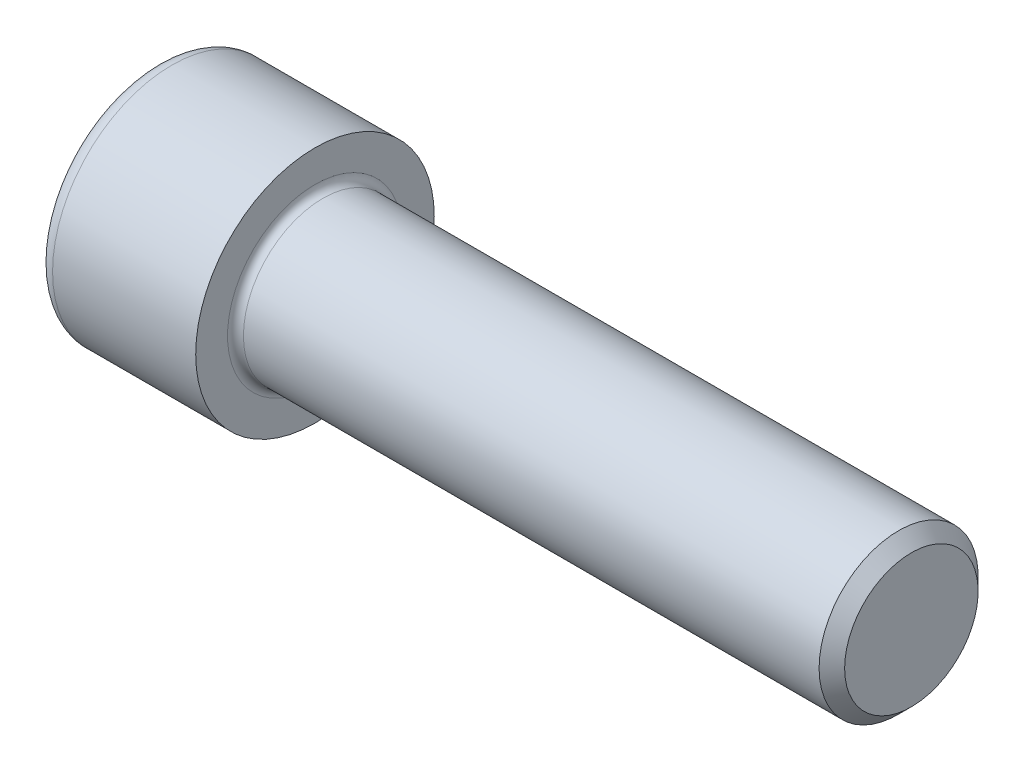
ISO-10303-21;
HEADER;
FILE_DESCRIPTION(('STEP AP214'),'2;1');
FILE_NAME('part.step','',(''),(''),'','','');
FILE_SCHEMA(('AUTOMOTIVE_DESIGN { 1 0 10303 214 1 1 1 1 }'));
ENDSEC;
DATA;
#1=APPLICATION_CONTEXT('core data for automotive mechanical design processes');
#2=APPLICATION_PROTOCOL_DEFINITION('international standard','automotive_design',2000,#1);
#3=PRODUCT_CONTEXT('',#1,'mechanical');
#4=PRODUCT('Part','Part','',(#3));
#5=PRODUCT_RELATED_PRODUCT_CATEGORY('part','',(#4));
#6=PRODUCT_DEFINITION_FORMATION('','',#4);
#7=PRODUCT_DEFINITION_CONTEXT('part definition',#1,'design');
#8=PRODUCT_DEFINITION('design','',#6,#7);
#9=PRODUCT_DEFINITION_SHAPE('','',#8);
#10=(LENGTH_UNIT() NAMED_UNIT(*) SI_UNIT(.MILLI.,.METRE.));
#11=(NAMED_UNIT(*) PLANE_ANGLE_UNIT() SI_UNIT($,.RADIAN.));
#12=(NAMED_UNIT(*) SI_UNIT($,.STERADIAN.) SOLID_ANGLE_UNIT());
#13=UNCERTAINTY_MEASURE_WITH_UNIT(LENGTH_MEASURE(1.E-05),#10,'distance_accuracy_value','');
#14=(GEOMETRIC_REPRESENTATION_CONTEXT(3) GLOBAL_UNCERTAINTY_ASSIGNED_CONTEXT((#13)) GLOBAL_UNIT_ASSIGNED_CONTEXT((#10,
#11,#12)) REPRESENTATION_CONTEXT('',''));
#15=CARTESIAN_POINT('',(0.,0.,0.));
#16=DIRECTION('',(0.,0.,1.));
#17=DIRECTION('',(1.,0.,0.));
#18=AXIS2_PLACEMENT_3D('',#15,#16,#17);
#19=CARTESIAN_POINT('',(0.,0.,0.));
#20=DIRECTION('',(-1.,0.,0.));
#21=DIRECTION('',(0.,0.,1.));
#22=AXIS2_PLACEMENT_3D('',#19,#20,#21);
#23=PLANE('',#22);
#24=DIRECTION('',(0.,-0.499999999999999,0.866025403784439));
#25=VECTOR('',#24,1.);
#26=CARTESIAN_POINT('',(0.,5.78793644862599,0.));
#27=LINE('',#26,#25);
#28=CARTESIAN_POINT('',(0.,5.78793644862599,0.));
#29=VERTEX_POINT('',#28);
#30=CARTESIAN_POINT('',(0.,2.893968224313,5.01249999999999));
#31=VERTEX_POINT('',#30);
#32=EDGE_CURVE('E259',#29,#31,#27,.T.);
#33=ORIENTED_EDGE('',*,*,#32,.T.);
#34=DIRECTION('',(0.,1.,0.));
#35=VECTOR('',#34,1.);
#36=CARTESIAN_POINT('',(0.,-2.893968224313,5.0125));
#37=LINE('',#36,#35);
#38=CARTESIAN_POINT('',(0.,-2.893968224313,5.0125));
#39=VERTEX_POINT('',#38);
#40=EDGE_CURVE('E131',#39,#31,#37,.T.);
#41=ORIENTED_EDGE('',*,*,#40,.F.);
#42=DIRECTION('',(0.,-0.500000000000001,-0.866025403784438));
#43=VECTOR('',#42,1.);
#44=CARTESIAN_POINT('',(0.,-2.893968224313,5.0125));
#45=LINE('',#44,#43);
#46=CARTESIAN_POINT('',(0.,-5.787936448626,0.));
#47=VERTEX_POINT('',#46);
#48=EDGE_CURVE('E262',#39,#47,#45,.T.);
#49=ORIENTED_EDGE('',*,*,#48,.T.);
#50=DIRECTION('',(0.,0.499999999999999,-0.866025403784439));
#51=VECTOR('',#50,1.);
#52=CARTESIAN_POINT('',(0.,-5.787936448626,0.));
#53=LINE('',#52,#51);
#54=CARTESIAN_POINT('',(0.,-2.89396822431301,-5.0125));
#55=VERTEX_POINT('',#54);
#56=EDGE_CURVE('E265',#47,#55,#53,.T.);
#57=ORIENTED_EDGE('',*,*,#56,.T.);
#58=DIRECTION('',(0.,-1.,0.));
#59=VECTOR('',#58,1.);
#60=CARTESIAN_POINT('',(0.,2.89396822431299,-5.01250000000001));
#61=LINE('',#60,#59);
#62=CARTESIAN_POINT('',(0.,2.89396822431299,-5.01250000000001));
#63=VERTEX_POINT('',#62);
#64=EDGE_CURVE('E268',#63,#55,#61,.T.);
#65=ORIENTED_EDGE('',*,*,#64,.F.);
#66=DIRECTION('',(0.,-0.500000000000001,-0.866025403784438));
#67=VECTOR('',#66,1.);
#68=CARTESIAN_POINT('',(0.,5.78793644862599,0.));
#69=LINE('',#68,#67);
#70=EDGE_CURVE('E126',#29,#63,#69,.T.);
#71=ORIENTED_EDGE('',*,*,#70,.F.);
#72=EDGE_LOOP('',(#33,#41,#49,#57,#65,#71));
#73=FACE_BOUND('',#72,.T.);
#74=CARTESIAN_POINT('',(0.,0.,0.));
#75=DIRECTION('',(-1.,0.,0.));
#76=DIRECTION('',(0.,0.,1.));
#77=AXIS2_PLACEMENT_3D('',#74,#75,#76);
#78=CIRCLE('',#77,7.8);
#79=CARTESIAN_POINT('',(0.,0.,7.8));
#80=VERTEX_POINT('',#79);
#81=EDGE_CURVE('E43',#80,#80,#78,.T.);
#82=ORIENTED_EDGE('',*,*,#81,.T.);
#83=EDGE_LOOP('',(#82));
#84=FACE_BOUND('',#83,.T.);
#85=ADVANCED_FACE('F35',(#73,#84),#23,.T.);
#86=CARTESIAN_POINT('',(-31.75,0.,0.));
#87=DIRECTION('',(-1.,0.,0.));
#88=DIRECTION('',(0.,0.,1.));
#89=AXIS2_PLACEMENT_3D('',#86,#87,#88);
#90=CYLINDRICAL_SURFACE('',#89,9.);
#91=CARTESIAN_POINT('',(1.2,0.,0.));
#92=DIRECTION('',(-1.,0.,0.));
#93=DIRECTION('',(0.,0.,1.));
#94=AXIS2_PLACEMENT_3D('',#91,#92,#93);
#95=CIRCLE('',#94,9.);
#96=CARTESIAN_POINT('',(1.2,0.,9.));
#97=VERTEX_POINT('',#96);
#98=EDGE_CURVE('E11',#97,#97,#95,.F.);
#99=ORIENTED_EDGE('',*,*,#98,.T.);
#100=EDGE_LOOP('',(#99));
#101=FACE_BOUND('',#100,.T.);
#102=CARTESIAN_POINT('',(12.,0.,0.));
#103=DIRECTION('',(-1.,0.,0.));
#104=DIRECTION('',(0.,0.,1.));
#105=AXIS2_PLACEMENT_3D('',#102,#103,#104);
#106=CIRCLE('',#105,9.);
#107=CARTESIAN_POINT('',(12.,0.,9.));
#108=VERTEX_POINT('',#107);
#109=EDGE_CURVE('E149',#108,#108,#106,.T.);
#110=ORIENTED_EDGE('',*,*,#109,.T.);
#111=EDGE_LOOP('',(#110));
#112=FACE_BOUND('',#111,.T.);
#113=ADVANCED_FACE('F173',(#101,#112),#90,.T.);
#114=CARTESIAN_POINT('',(12.,9.,0.));
#115=DIRECTION('',(1.,0.,0.));
#116=DIRECTION('',(0.,0.,-1.));
#117=AXIS2_PLACEMENT_3D('',#114,#115,#116);
#118=PLANE('',#117);
#119=CARTESIAN_POINT('',(12.,0.,0.));
#120=DIRECTION('',(1.,0.,0.));
#121=DIRECTION('',(0.,0.,-1.));
#122=AXIS2_PLACEMENT_3D('',#119,#120,#121);
#123=CIRCLE('',#122,6.59999999999999);
#124=CARTESIAN_POINT('',(12.,0.,-6.59999999999999));
#125=VERTEX_POINT('',#124);
#126=EDGE_CURVE('E152',#125,#125,#123,.F.);
#127=ORIENTED_EDGE('',*,*,#126,.T.);
#128=EDGE_LOOP('',(#127));
#129=FACE_BOUND('',#128,.T.);
#130=ORIENTED_EDGE('',*,*,#109,.F.);
#131=EDGE_LOOP('',(#130));
#132=FACE_BOUND('',#131,.T.);
#133=ADVANCED_FACE('F179',(#129,#132),#118,.T.);
#134=CARTESIAN_POINT('',(-31.75,0.,0.));
#135=DIRECTION('',(-1.,0.,0.));
#136=DIRECTION('',(0.,0.,1.));
#137=AXIS2_PLACEMENT_3D('',#134,#135,#136);
#138=CYLINDRICAL_SURFACE('',#137,5.99999999999999);
#139=CARTESIAN_POINT('',(12.6,0.,0.));
#140=DIRECTION('',(1.,0.,0.));
#141=DIRECTION('',(0.,0.,-1.));
#142=AXIS2_PLACEMENT_3D('',#139,#140,#141);
#143=CIRCLE('',#142,5.99999999999999);
#144=CARTESIAN_POINT('',(12.6,0.,-5.99999999999999));
#145=VERTEX_POINT('',#144);
#146=EDGE_CURVE('E155',#145,#145,#143,.T.);
#147=ORIENTED_EDGE('',*,*,#146,.T.);
#148=EDGE_LOOP('',(#147));
#149=FACE_BOUND('',#148,.T.);
#150=CARTESIAN_POINT('',(56.036,0.,0.));
#151=DIRECTION('',(-1.,0.,0.));
#152=DIRECTION('',(0.,0.,1.));
#153=AXIS2_PLACEMENT_3D('',#150,#151,#152);
#154=CIRCLE('',#153,5.99999999999998);
#155=CARTESIAN_POINT('',(56.036,0.,5.99999999999998));
#156=VERTEX_POINT('',#155);
#157=EDGE_CURVE('E146',#156,#156,#154,.T.);
#158=ORIENTED_EDGE('',*,*,#157,.T.);
#159=EDGE_LOOP('',(#158));
#160=FACE_BOUND('',#159,.T.);
#161=ADVANCED_FACE('F185',(#149,#160),#138,.T.);
#162=CARTESIAN_POINT('',(57.,0.,0.));
#163=DIRECTION('',(-1.,0.,0.));
#164=DIRECTION('',(0.,0.,1.));
#165=AXIS2_PLACEMENT_3D('',#162,#163,#164);
#166=CONICAL_SURFACE('',#165,5.036,0.785398163397425);
#167=ORIENTED_EDGE('',*,*,#157,.F.);
#168=EDGE_LOOP('',(#167));
#169=FACE_BOUND('',#168,.T.);
#170=CARTESIAN_POINT('',(57.,0.,0.));
#171=DIRECTION('',(-1.,0.,0.));
#172=DIRECTION('',(0.,0.,1.));
#173=AXIS2_PLACEMENT_3D('',#170,#171,#172);
#174=CIRCLE('',#173,5.036);
#175=CARTESIAN_POINT('',(57.,0.,5.036));
#176=VERTEX_POINT('',#175);
#177=EDGE_CURVE('E142',#176,#176,#174,.T.);
#178=ORIENTED_EDGE('',*,*,#177,.T.);
#179=EDGE_LOOP('',(#178));
#180=FACE_BOUND('',#179,.T.);
#181=ADVANCED_FACE('F189',(#169,#180),#166,.T.);
#182=CARTESIAN_POINT('',(57.,5.036,0.));
#183=DIRECTION('',(1.,0.,0.));
#184=DIRECTION('',(0.,0.,-1.));
#185=AXIS2_PLACEMENT_3D('',#182,#183,#184);
#186=PLANE('',#185);
#187=ORIENTED_EDGE('',*,*,#177,.F.);
#188=EDGE_LOOP('',(#187));
#189=FACE_BOUND('',#188,.T.);
#190=ADVANCED_FACE('F169',(#189),#186,.T.);
#191=CARTESIAN_POINT('',(12.6,0.,0.));
#192=DIRECTION('',(1.,0.,0.));
#193=DIRECTION('',(0.,0.,-1.));
#194=AXIS2_PLACEMENT_3D('',#191,#192,#193);
#195=TOROIDAL_SURFACE('',#194,6.59999999999999,0.6);
#196=ORIENTED_EDGE('',*,*,#146,.F.);
#197=EDGE_LOOP('',(#196));
#198=FACE_BOUND('',#197,.T.);
#199=ORIENTED_EDGE('',*,*,#126,.F.);
#200=EDGE_LOOP('',(#199));
#201=FACE_BOUND('',#200,.T.);
#202=ADVANCED_FACE('F162',(#198,#201),#195,.F.);
#203=CARTESIAN_POINT('',(1.2,0.,0.));
#204=DIRECTION('',(-1.,0.,0.));
#205=DIRECTION('',(0.,0.,1.));
#206=AXIS2_PLACEMENT_3D('',#203,#204,#205);
#207=TOROIDAL_SURFACE('',#206,7.8,1.2);
#208=ORIENTED_EDGE('',*,*,#98,.F.);
#209=EDGE_LOOP('',(#208));
#210=FACE_BOUND('',#209,.T.);
#211=ORIENTED_EDGE('',*,*,#81,.F.);
#212=EDGE_LOOP('',(#211));
#213=FACE_BOUND('',#212,.T.);
#214=ADVANCED_FACE('F37',(#210,#213),#207,.T.);
#215=CARTESIAN_POINT('',(6.,5.78793644862599,0.));
#216=DIRECTION('',(0.,-0.866025403784439,-0.499999999999999));
#217=DIRECTION('',(0.,0.499999999999999,-0.866025403784439));
#218=AXIS2_PLACEMENT_3D('',#215,#216,#217);
#219=PLANE('',#218);
#220=ORIENTED_EDGE('',*,*,#32,.F.);
#221=DIRECTION('',(-1.,0.,0.));
#222=VECTOR('',#221,1.);
#223=CARTESIAN_POINT('',(6.,5.78793644862599,0.));
#224=LINE('',#223,#222);
#225=CARTESIAN_POINT('',(6.,5.78793644862599,0.));
#226=VERTEX_POINT('',#225);
#227=EDGE_CURVE('E249',#226,#29,#224,.T.);
#228=ORIENTED_EDGE('',*,*,#227,.F.);
#229=DIRECTION('',(0.,-0.499999999999999,0.866025403784439));
#230=VECTOR('',#229,1.);
#231=CARTESIAN_POINT('',(6.,5.78793644862599,0.));
#232=LINE('',#231,#230);
#233=CARTESIAN_POINT('',(6.,4.3409523364695,2.50624999999999));
#234=VERTEX_POINT('',#233);
#235=EDGE_CURVE('E118',#226,#234,#232,.T.);
#236=ORIENTED_EDGE('',*,*,#235,.T.);
#237=CARTESIAN_POINT('',(6.,2.893968224313,5.01249999999999));
#238=VERTEX_POINT('',#237);
#239=EDGE_CURVE('E109',#234,#238,#232,.T.);
#240=ORIENTED_EDGE('',*,*,#239,.T.);
#241=DIRECTION('',(-1.,0.,0.));
#242=VECTOR('',#241,1.);
#243=CARTESIAN_POINT('',(6.,2.893968224313,5.01249999999999));
#244=LINE('',#243,#242);
#245=EDGE_CURVE('E123',#238,#31,#244,.T.);
#246=ORIENTED_EDGE('',*,*,#245,.T.);
#247=EDGE_LOOP('',(#220,#228,#236,#240,#246));
#248=FACE_BOUND('',#247,.T.);
#249=ADVANCED_FACE('F122',(#248),#219,.T.);
#250=CARTESIAN_POINT('',(6.,-2.893968224313,5.0125));
#251=DIRECTION('',(0.,0.,1.));
#252=DIRECTION('',(0.,-1.,0.));
#253=AXIS2_PLACEMENT_3D('',#250,#251,#252);
#254=PLANE('',#253);
#255=ORIENTED_EDGE('',*,*,#40,.T.);
#256=ORIENTED_EDGE('',*,*,#245,.F.);
#257=DIRECTION('',(0.,1.,0.));
#258=VECTOR('',#257,1.);
#259=CARTESIAN_POINT('',(6.,-2.893968224313,5.0125));
#260=LINE('',#259,#258);
#261=CARTESIAN_POINT('',(6.,0.,5.0125));
#262=VERTEX_POINT('',#261);
#263=EDGE_CURVE('E106',#262,#238,#260,.T.);
#264=ORIENTED_EDGE('',*,*,#263,.F.);
#265=CARTESIAN_POINT('',(6.,-2.893968224313,5.0125));
#266=VERTEX_POINT('',#265);
#267=EDGE_CURVE('E117',#266,#262,#260,.T.);
#268=ORIENTED_EDGE('',*,*,#267,.F.);
#269=DIRECTION('',(-1.,0.,0.));
#270=VECTOR('',#269,1.);
#271=CARTESIAN_POINT('',(6.,-2.893968224313,5.0125));
#272=LINE('',#271,#270);
#273=EDGE_CURVE('E133',#266,#39,#272,.T.);
#274=ORIENTED_EDGE('',*,*,#273,.T.);
#275=EDGE_LOOP('',(#255,#256,#264,#268,#274));
#276=FACE_BOUND('',#275,.T.);
#277=ADVANCED_FACE('F128',(#276),#254,.F.);
#278=CARTESIAN_POINT('',(6.,-2.893968224313,5.0125));
#279=DIRECTION('',(0.,0.866025403784438,-0.500000000000001));
#280=DIRECTION('',(0.,0.500000000000001,0.866025403784438));
#281=AXIS2_PLACEMENT_3D('',#278,#279,#280);
#282=PLANE('',#281);
#283=ORIENTED_EDGE('',*,*,#48,.F.);
#284=ORIENTED_EDGE('',*,*,#273,.F.);
#285=DIRECTION('',(0.,-0.500000000000001,-0.866025403784438));
#286=VECTOR('',#285,1.);
#287=CARTESIAN_POINT('',(6.,-2.893968224313,5.0125));
#288=LINE('',#287,#286);
#289=CARTESIAN_POINT('',(6.,-4.3409523364695,2.50625000000001));
#290=VERTEX_POINT('',#289);
#291=EDGE_CURVE('E288',#266,#290,#288,.T.);
#292=ORIENTED_EDGE('',*,*,#291,.T.);
#293=CARTESIAN_POINT('',(6.,-5.787936448626,0.));
#294=VERTEX_POINT('',#293);
#295=EDGE_CURVE('E277',#290,#294,#288,.T.);
#296=ORIENTED_EDGE('',*,*,#295,.T.);
#297=DIRECTION('',(-1.,0.,0.));
#298=VECTOR('',#297,1.);
#299=CARTESIAN_POINT('',(6.,-5.787936448626,0.));
#300=LINE('',#299,#298);
#301=EDGE_CURVE('E138',#294,#47,#300,.T.);
#302=ORIENTED_EDGE('',*,*,#301,.T.);
#303=EDGE_LOOP('',(#283,#284,#292,#296,#302));
#304=FACE_BOUND('',#303,.T.);
#305=ADVANCED_FACE('F203',(#304),#282,.T.);
#306=CARTESIAN_POINT('',(6.,-5.787936448626,0.));
#307=DIRECTION('',(0.,0.866025403784439,0.499999999999998));
#308=DIRECTION('',(0.,-0.499999999999999,0.86602540378444));
#309=AXIS2_PLACEMENT_3D('',#306,#307,#308);
#310=PLANE('',#309);
#311=ORIENTED_EDGE('',*,*,#56,.F.);
#312=ORIENTED_EDGE('',*,*,#301,.F.);
#313=DIRECTION('',(0.,0.499999999999999,-0.866025403784439));
#314=VECTOR('',#313,1.);
#315=CARTESIAN_POINT('',(6.,-5.787936448626,0.));
#316=LINE('',#315,#314);
#317=CARTESIAN_POINT('',(6.,-4.34095233646951,-2.50625));
#318=VERTEX_POINT('',#317);
#319=EDGE_CURVE('E255',#294,#318,#316,.T.);
#320=ORIENTED_EDGE('',*,*,#319,.T.);
#321=CARTESIAN_POINT('',(6.,-2.89396822431301,-5.0125));
#322=VERTEX_POINT('',#321);
#323=EDGE_CURVE('E287',#318,#322,#316,.T.);
#324=ORIENTED_EDGE('',*,*,#323,.T.);
#325=DIRECTION('',(-1.,0.,0.));
#326=VECTOR('',#325,1.);
#327=CARTESIAN_POINT('',(6.,-2.89396822431301,-5.0125));
#328=LINE('',#327,#326);
#329=EDGE_CURVE('E248',#322,#55,#328,.T.);
#330=ORIENTED_EDGE('',*,*,#329,.T.);
#331=EDGE_LOOP('',(#311,#312,#320,#324,#330));
#332=FACE_BOUND('',#331,.T.);
#333=ADVANCED_FACE('F206',(#332),#310,.T.);
#334=CARTESIAN_POINT('',(6.,2.89396822431299,-5.01250000000001));
#335=DIRECTION('',(0.,0.,-1.));
#336=DIRECTION('',(0.,1.,0.));
#337=AXIS2_PLACEMENT_3D('',#334,#335,#336);
#338=PLANE('',#337);
#339=ORIENTED_EDGE('',*,*,#64,.T.);
#340=ORIENTED_EDGE('',*,*,#329,.F.);
#341=DIRECTION('',(0.,-1.,0.));
#342=VECTOR('',#341,1.);
#343=CARTESIAN_POINT('',(6.,2.89396822431299,-5.01250000000001));
#344=LINE('',#343,#342);
#345=CARTESIAN_POINT('',(6.,0.,-5.0125));
#346=VERTEX_POINT('',#345);
#347=EDGE_CURVE('E252',#346,#322,#344,.T.);
#348=ORIENTED_EDGE('',*,*,#347,.F.);
#349=CARTESIAN_POINT('',(6.,2.89396822431299,-5.01250000000001));
#350=VERTEX_POINT('',#349);
#351=EDGE_CURVE('E50',#350,#346,#344,.T.);
#352=ORIENTED_EDGE('',*,*,#351,.F.);
#353=DIRECTION('',(-1.,0.,0.));
#354=VECTOR('',#353,1.);
#355=CARTESIAN_POINT('',(6.,2.89396822431299,-5.01250000000001));
#356=LINE('',#355,#354);
#357=EDGE_CURVE('E245',#350,#63,#356,.T.);
#358=ORIENTED_EDGE('',*,*,#357,.T.);
#359=EDGE_LOOP('',(#339,#340,#348,#352,#358));
#360=FACE_BOUND('',#359,.T.);
#361=ADVANCED_FACE('F210',(#360),#338,.F.);
#362=CARTESIAN_POINT('',(6.,5.78793644862599,0.));
#363=DIRECTION('',(0.,0.866025403784438,-0.500000000000001));
#364=DIRECTION('',(0.,0.500000000000001,0.866025403784438));
#365=AXIS2_PLACEMENT_3D('',#362,#363,#364);
#366=PLANE('',#365);
#367=ORIENTED_EDGE('',*,*,#70,.T.);
#368=ORIENTED_EDGE('',*,*,#357,.F.);
#369=DIRECTION('',(0.,-0.500000000000001,-0.866025403784438));
#370=VECTOR('',#369,1.);
#371=CARTESIAN_POINT('',(6.,5.78793644862599,0.));
#372=LINE('',#371,#370);
#373=CARTESIAN_POINT('',(6.,4.34095233646949,-2.50625));
#374=VERTEX_POINT('',#373);
#375=EDGE_CURVE('E235',#374,#350,#372,.T.);
#376=ORIENTED_EDGE('',*,*,#375,.F.);
#377=EDGE_CURVE('E241',#226,#374,#372,.T.);
#378=ORIENTED_EDGE('',*,*,#377,.F.);
#379=ORIENTED_EDGE('',*,*,#227,.T.);
#380=EDGE_LOOP('',(#367,#368,#376,#378,#379));
#381=FACE_BOUND('',#380,.T.);
#382=ADVANCED_FACE('F214',(#381),#366,.F.);
#383=CARTESIAN_POINT('',(6.,5.78793644862599,0.));
#384=DIRECTION('',(1.,0.,0.));
#385=DIRECTION('',(0.,0.,-1.));
#386=AXIS2_PLACEMENT_3D('',#383,#384,#385);
#387=PLANE('',#386);
#388=ORIENTED_EDGE('',*,*,#347,.T.);
#389=ORIENTED_EDGE('',*,*,#323,.F.);
#390=CARTESIAN_POINT('',(6.,0.,0.));
#391=DIRECTION('',(-1.,0.,0.));
#392=DIRECTION('',(0.,0.,1.));
#393=AXIS2_PLACEMENT_3D('',#390,#391,#392);
#394=CIRCLE('',#393,5.0125);
#395=EDGE_CURVE('E283',#346,#318,#394,.T.);
#396=ORIENTED_EDGE('',*,*,#395,.F.);
#397=EDGE_LOOP('',(#388,#389,#396));
#398=FACE_BOUND('',#397,.T.);
#399=ADVANCED_FACE('F218',(#398),#387,.F.);
#400=ORIENTED_EDGE('',*,*,#319,.F.);
#401=ORIENTED_EDGE('',*,*,#295,.F.);
#402=EDGE_CURVE('E136',#318,#290,#394,.T.);
#403=ORIENTED_EDGE('',*,*,#402,.F.);
#404=EDGE_LOOP('',(#400,#401,#403));
#405=FACE_BOUND('',#404,.T.);
#406=ADVANCED_FACE('F221',(#405),#387,.F.);
#407=ORIENTED_EDGE('',*,*,#291,.F.);
#408=ORIENTED_EDGE('',*,*,#267,.T.);
#409=EDGE_CURVE('E132',#290,#262,#394,.T.);
#410=ORIENTED_EDGE('',*,*,#409,.F.);
#411=EDGE_LOOP('',(#407,#408,#410));
#412=FACE_BOUND('',#411,.T.);
#413=ADVANCED_FACE('F226',(#412),#387,.F.);
#414=ORIENTED_EDGE('',*,*,#263,.T.);
#415=ORIENTED_EDGE('',*,*,#239,.F.);
#416=EDGE_CURVE('E112',#262,#234,#394,.T.);
#417=ORIENTED_EDGE('',*,*,#416,.F.);
#418=EDGE_LOOP('',(#414,#415,#417));
#419=FACE_BOUND('',#418,.T.);
#420=ADVANCED_FACE('F108',(#419),#387,.F.);
#421=ORIENTED_EDGE('',*,*,#235,.F.);
#422=ORIENTED_EDGE('',*,*,#377,.T.);
#423=EDGE_CURVE('E143',#234,#374,#394,.T.);
#424=ORIENTED_EDGE('',*,*,#423,.F.);
#425=EDGE_LOOP('',(#421,#422,#424));
#426=FACE_BOUND('',#425,.T.);
#427=ADVANCED_FACE('F229',(#426),#387,.F.);
#428=ORIENTED_EDGE('',*,*,#375,.T.);
#429=ORIENTED_EDGE('',*,*,#351,.T.);
#430=EDGE_CURVE('E238',#374,#346,#394,.T.);
#431=ORIENTED_EDGE('',*,*,#430,.F.);
#432=EDGE_LOOP('',(#428,#429,#431));
#433=FACE_BOUND('',#432,.T.);
#434=ADVANCED_FACE('F199',(#433),#387,.F.);
#435=CARTESIAN_POINT('',(6.,0.,0.));
#436=DIRECTION('',(-1.,0.,0.));
#437=DIRECTION('',(0.,0.,1.));
#438=AXIS2_PLACEMENT_3D('',#435,#436,#437);
#439=CONICAL_SURFACE('',#438,5.0125,1.04719755119659);
#440=CARTESIAN_POINT('',(8.89396822431303,0.,0.));
#441=VERTEX_POINT('',#440);
#442=VERTEX_LOOP('',#441);
#443=FACE_BOUND('',#442,.T.);
#444=ORIENTED_EDGE('',*,*,#416,.T.);
#445=ORIENTED_EDGE('',*,*,#423,.T.);
#446=ORIENTED_EDGE('',*,*,#430,.T.);
#447=ORIENTED_EDGE('',*,*,#395,.T.);
#448=ORIENTED_EDGE('',*,*,#402,.T.);
#449=ORIENTED_EDGE('',*,*,#409,.T.);
#450=EDGE_LOOP('',(#444,#445,#446,#447,#448,#449));
#451=FACE_BOUND('',#450,.T.);
#452=ADVANCED_FACE('F197',(#443,#451),#439,.F.);
#453=CLOSED_SHELL('',(#85,#113,#133,#161,#181,#190,#202,#214,#249,#277,#305,#333,#361,#382,#399,
#406,#413,#420,#427,#434,#452));
#454=MANIFOLD_SOLID_BREP('B2',#453);
#455=ADVANCED_BREP_SHAPE_REPRESENTATION('',(#18,#454),#14);
#456=SHAPE_DEFINITION_REPRESENTATION(#9,#455);
ENDSEC;
END-ISO-10303-21;
